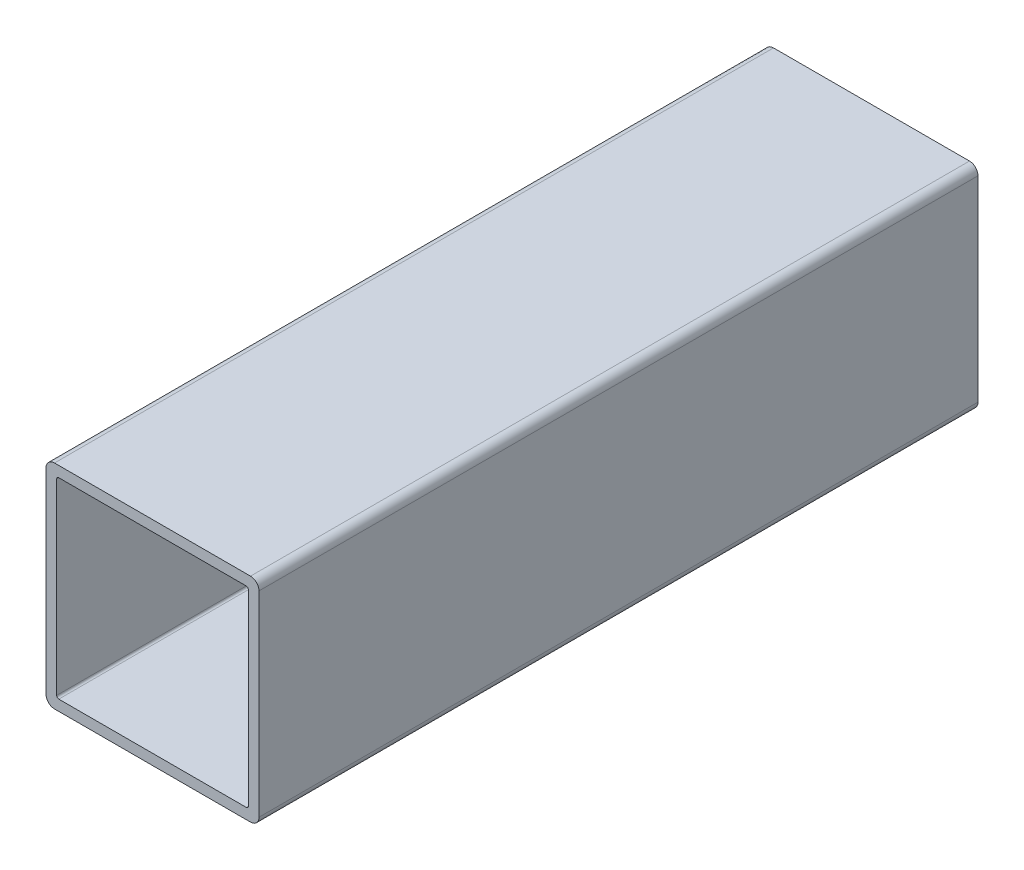
ISO-10303-21;
HEADER;
FILE_DESCRIPTION(('STEP AP214'),'2;1');
FILE_NAME('part.step','',(''),(''),'','','');
FILE_SCHEMA(('AUTOMOTIVE_DESIGN { 1 0 10303 214 1 1 1 1 }'));
ENDSEC;
DATA;
#1=APPLICATION_CONTEXT('core data for automotive mechanical design processes');
#2=APPLICATION_PROTOCOL_DEFINITION('international standard','automotive_design',2000,#1);
#3=PRODUCT_CONTEXT('',#1,'mechanical');
#4=PRODUCT('Part','Part','',(#3));
#5=PRODUCT_RELATED_PRODUCT_CATEGORY('part','',(#4));
#6=PRODUCT_DEFINITION_FORMATION('','',#4);
#7=PRODUCT_DEFINITION_CONTEXT('part definition',#1,'design');
#8=PRODUCT_DEFINITION('design','',#6,#7);
#9=PRODUCT_DEFINITION_SHAPE('','',#8);
#10=(LENGTH_UNIT() NAMED_UNIT(*) SI_UNIT(.MILLI.,.METRE.));
#11=(NAMED_UNIT(*) PLANE_ANGLE_UNIT() SI_UNIT($,.RADIAN.));
#12=(NAMED_UNIT(*) SI_UNIT($,.STERADIAN.) SOLID_ANGLE_UNIT());
#13=UNCERTAINTY_MEASURE_WITH_UNIT(LENGTH_MEASURE(1.E-05),#10,'distance_accuracy_value','');
#14=(GEOMETRIC_REPRESENTATION_CONTEXT(3) GLOBAL_UNCERTAINTY_ASSIGNED_CONTEXT((#13)) GLOBAL_UNIT_ASSIGNED_CONTEXT((#10,
#11,#12)) REPRESENTATION_CONTEXT('',''));
#15=CARTESIAN_POINT('',(0.,0.,0.));
#16=DIRECTION('',(0.,0.,1.));
#17=DIRECTION('',(1.,0.,0.));
#18=AXIS2_PLACEMENT_3D('',#15,#16,#17);
#19=CARTESIAN_POINT('',(358.3,0.,-825.));
#20=DIRECTION('',(0.,0.,1.));
#21=DIRECTION('',(1.,0.,0.));
#22=AXIS2_PLACEMENT_3D('',#19,#20,#21);
#23=PLANE('',#22);
#24=DIRECTION('',(0.,1.,0.));
#25=VECTOR('',#24,1.);
#26=CARTESIAN_POINT('',(-363.3,-4.45076074760841E-13,-825.));
#27=LINE('',#26,#25);
#28=CARTESIAN_POINT('',(-363.3,5.99999999999999,-825.));
#29=VERTEX_POINT('',#28);
#30=CARTESIAN_POINT('',(-363.3,94.,-825.));
#31=VERTEX_POINT('',#30);
#32=EDGE_CURVE('E232',#29,#31,#27,.T.);
#33=ORIENTED_EDGE('',*,*,#32,.T.);
#34=CARTESIAN_POINT('',(-364.3,94.,-825.));
#35=DIRECTION('',(0.,0.,1.));
#36=DIRECTION('',(1.,0.,0.));
#37=AXIS2_PLACEMENT_3D('',#34,#35,#36);
#38=CIRCLE('',#37,1.);
#39=CARTESIAN_POINT('',(-364.3,95.,-825.));
#40=VERTEX_POINT('',#39);
#41=EDGE_CURVE('E12',#31,#40,#38,.T.);
#42=ORIENTED_EDGE('',*,*,#41,.T.);
#43=DIRECTION('',(-1.,0.,0.));
#44=VECTOR('',#43,1.);
#45=CARTESIAN_POINT('',(358.3,94.9999999999999,-825.));
#46=LINE('',#45,#44);
#47=CARTESIAN_POINT('',(-452.3,95.,-825.));
#48=VERTEX_POINT('',#47);
#49=EDGE_CURVE('E229',#40,#48,#46,.T.);
#50=ORIENTED_EDGE('',*,*,#49,.T.);
#51=CARTESIAN_POINT('',(-452.3,94.,-825.));
#52=DIRECTION('',(0.,0.,1.));
#53=DIRECTION('',(1.,0.,0.));
#54=AXIS2_PLACEMENT_3D('',#51,#52,#53);
#55=CIRCLE('',#54,1.);
#56=CARTESIAN_POINT('',(-453.3,94.,-825.));
#57=VERTEX_POINT('',#56);
#58=EDGE_CURVE('E211',#48,#57,#55,.T.);
#59=ORIENTED_EDGE('',*,*,#58,.T.);
#60=DIRECTION('',(0.,-1.,0.));
#61=VECTOR('',#60,1.);
#62=CARTESIAN_POINT('',(-453.3,0.,-825.));
#63=LINE('',#62,#61);
#64=CARTESIAN_POINT('',(-453.3,5.99999999999999,-825.));
#65=VERTEX_POINT('',#64);
#66=EDGE_CURVE('E231',#57,#65,#63,.T.);
#67=ORIENTED_EDGE('',*,*,#66,.T.);
#68=CARTESIAN_POINT('',(-452.3,5.99999999999999,-825.));
#69=DIRECTION('',(0.,0.,1.));
#70=DIRECTION('',(1.,0.,0.));
#71=AXIS2_PLACEMENT_3D('',#68,#69,#70);
#72=CIRCLE('',#71,1.);
#73=CARTESIAN_POINT('',(-452.3,4.99999999999999,-825.));
#74=VERTEX_POINT('',#73);
#75=EDGE_CURVE('E207',#65,#74,#72,.T.);
#76=ORIENTED_EDGE('',*,*,#75,.T.);
#77=DIRECTION('',(1.,0.,0.));
#78=VECTOR('',#77,1.);
#79=CARTESIAN_POINT('',(358.3,4.99999999999999,-825.));
#80=LINE('',#79,#78);
#81=CARTESIAN_POINT('',(-364.3,4.99999999999999,-825.));
#82=VERTEX_POINT('',#81);
#83=EDGE_CURVE('E236',#74,#82,#80,.T.);
#84=ORIENTED_EDGE('',*,*,#83,.T.);
#85=CARTESIAN_POINT('',(-364.3,5.99999999999999,-825.));
#86=DIRECTION('',(0.,0.,1.));
#87=DIRECTION('',(1.,0.,0.));
#88=AXIS2_PLACEMENT_3D('',#85,#86,#87);
#89=CIRCLE('',#88,1.);
#90=EDGE_CURVE('E203',#82,#29,#89,.T.);
#91=ORIENTED_EDGE('',*,*,#90,.T.);
#92=EDGE_LOOP('',(#33,#42,#50,#59,#67,#76,#84,#91));
#93=FACE_BOUND('',#92,.T.);
#94=DIRECTION('',(-1.,0.,0.));
#95=VECTOR('',#94,1.);
#96=CARTESIAN_POINT('',(0.,0.,-825.));
#97=LINE('',#96,#95);
#98=CARTESIAN_POINT('',(-362.3,0.,-825.));
#99=VERTEX_POINT('',#98);
#100=CARTESIAN_POINT('',(-454.3,0.,-825.));
#101=VERTEX_POINT('',#100);
#102=EDGE_CURVE('E136',#99,#101,#97,.T.);
#103=ORIENTED_EDGE('',*,*,#102,.T.);
#104=CARTESIAN_POINT('',(-454.3,4.,-825.));
#105=DIRECTION('',(0.,0.,1.));
#106=DIRECTION('',(1.,0.,0.));
#107=AXIS2_PLACEMENT_3D('',#104,#105,#106);
#108=CIRCLE('',#107,4.);
#109=CARTESIAN_POINT('',(-458.3,4.,-825.));
#110=VERTEX_POINT('',#109);
#111=EDGE_CURVE('E142',#101,#110,#108,.F.);
#112=ORIENTED_EDGE('',*,*,#111,.T.);
#113=DIRECTION('',(0.,1.,0.));
#114=VECTOR('',#113,1.);
#115=CARTESIAN_POINT('',(-458.3,100.,-825.));
#116=LINE('',#115,#114);
#117=CARTESIAN_POINT('',(-458.3,96.,-825.));
#118=VERTEX_POINT('',#117);
#119=EDGE_CURVE('E243',#118,#110,#116,.F.);
#120=ORIENTED_EDGE('',*,*,#119,.F.);
#121=CARTESIAN_POINT('',(-454.3,96.,-825.));
#122=DIRECTION('',(0.,0.,1.));
#123=DIRECTION('',(1.,0.,0.));
#124=AXIS2_PLACEMENT_3D('',#121,#122,#123);
#125=CIRCLE('',#124,4.);
#126=CARTESIAN_POINT('',(-454.3,100.,-825.));
#127=VERTEX_POINT('',#126);
#128=EDGE_CURVE('E161',#118,#127,#125,.F.);
#129=ORIENTED_EDGE('',*,*,#128,.T.);
#130=DIRECTION('',(1.,0.,0.));
#131=VECTOR('',#130,1.);
#132=CARTESIAN_POINT('',(358.3,100.,-825.));
#133=LINE('',#132,#131);
#134=CARTESIAN_POINT('',(-362.3,100.,-825.));
#135=VERTEX_POINT('',#134);
#136=EDGE_CURVE('E267',#127,#135,#133,.T.);
#137=ORIENTED_EDGE('',*,*,#136,.T.);
#138=CARTESIAN_POINT('',(-362.3,96.,-825.));
#139=DIRECTION('',(0.,0.,1.));
#140=DIRECTION('',(1.,0.,0.));
#141=AXIS2_PLACEMENT_3D('',#138,#139,#140);
#142=CIRCLE('',#141,4.);
#143=CARTESIAN_POINT('',(-358.3,96.,-825.));
#144=VERTEX_POINT('',#143);
#145=EDGE_CURVE('E143',#135,#144,#142,.F.);
#146=ORIENTED_EDGE('',*,*,#145,.T.);
#147=DIRECTION('',(0.,1.,0.));
#148=VECTOR('',#147,1.);
#149=CARTESIAN_POINT('',(-358.3,100.,-825.));
#150=LINE('',#149,#148);
#151=CARTESIAN_POINT('',(-358.3,4.,-825.));
#152=VERTEX_POINT('',#151);
#153=EDGE_CURVE('E138',#144,#152,#150,.F.);
#154=ORIENTED_EDGE('',*,*,#153,.T.);
#155=CARTESIAN_POINT('',(-362.3,4.,-825.));
#156=DIRECTION('',(0.,0.,1.));
#157=DIRECTION('',(1.,0.,0.));
#158=AXIS2_PLACEMENT_3D('',#155,#156,#157);
#159=CIRCLE('',#158,4.);
#160=EDGE_CURVE('E133',#152,#99,#159,.F.);
#161=ORIENTED_EDGE('',*,*,#160,.T.);
#162=EDGE_LOOP('',(#103,#112,#120,#129,#137,#146,#154,#161));
#163=FACE_BOUND('',#162,.T.);
#164=ADVANCED_FACE('F19',(#93,#163),#23,.F.);
#165=CARTESIAN_POINT('',(-358.3,0.,-487.5));
#166=DIRECTION('',(0.,0.,-1.));
#167=DIRECTION('',(-1.,0.,0.));
#168=AXIS2_PLACEMENT_3D('',#165,#166,#167);
#169=PLANE('',#168);
#170=DIRECTION('',(0.,-1.,0.));
#171=VECTOR('',#170,1.);
#172=CARTESIAN_POINT('',(-363.3,0.,-487.5));
#173=LINE('',#172,#171);
#174=CARTESIAN_POINT('',(-363.3,94.,-487.5));
#175=VERTEX_POINT('',#174);
#176=CARTESIAN_POINT('',(-363.3,6.,-487.5));
#177=VERTEX_POINT('',#176);
#178=EDGE_CURVE('E218',#175,#177,#173,.T.);
#179=ORIENTED_EDGE('',*,*,#178,.T.);
#180=CARTESIAN_POINT('',(-364.3,6.,-487.5));
#181=DIRECTION('',(0.,0.,-1.));
#182=DIRECTION('',(-1.,0.,0.));
#183=AXIS2_PLACEMENT_3D('',#180,#181,#182);
#184=CIRCLE('',#183,1.);
#185=CARTESIAN_POINT('',(-364.3,5.,-487.5));
#186=VERTEX_POINT('',#185);
#187=EDGE_CURVE('E201',#177,#186,#184,.T.);
#188=ORIENTED_EDGE('',*,*,#187,.T.);
#189=DIRECTION('',(-1.,0.,0.));
#190=VECTOR('',#189,1.);
#191=CARTESIAN_POINT('',(-358.3,5.,-487.5));
#192=LINE('',#191,#190);
#193=CARTESIAN_POINT('',(-452.3,5.,-487.5));
#194=VERTEX_POINT('',#193);
#195=EDGE_CURVE('E226',#186,#194,#192,.T.);
#196=ORIENTED_EDGE('',*,*,#195,.T.);
#197=CARTESIAN_POINT('',(-452.3,6.,-487.5));
#198=DIRECTION('',(0.,0.,-1.));
#199=DIRECTION('',(-1.,0.,0.));
#200=AXIS2_PLACEMENT_3D('',#197,#198,#199);
#201=CIRCLE('',#200,1.);
#202=CARTESIAN_POINT('',(-453.3,6.,-487.5));
#203=VERTEX_POINT('',#202);
#204=EDGE_CURVE('E205',#194,#203,#201,.T.);
#205=ORIENTED_EDGE('',*,*,#204,.T.);
#206=DIRECTION('',(0.,1.,0.));
#207=VECTOR('',#206,1.);
#208=CARTESIAN_POINT('',(-453.3,0.,-487.5));
#209=LINE('',#208,#207);
#210=CARTESIAN_POINT('',(-453.3,94.,-487.5));
#211=VERTEX_POINT('',#210);
#212=EDGE_CURVE('E159',#203,#211,#209,.T.);
#213=ORIENTED_EDGE('',*,*,#212,.T.);
#214=CARTESIAN_POINT('',(-452.3,94.,-487.5));
#215=DIRECTION('',(0.,0.,-1.));
#216=DIRECTION('',(-1.,0.,0.));
#217=AXIS2_PLACEMENT_3D('',#214,#215,#216);
#218=CIRCLE('',#217,1.);
#219=CARTESIAN_POINT('',(-452.3,95.,-487.5));
#220=VERTEX_POINT('',#219);
#221=EDGE_CURVE('E209',#211,#220,#218,.T.);
#222=ORIENTED_EDGE('',*,*,#221,.T.);
#223=DIRECTION('',(1.,0.,0.));
#224=VECTOR('',#223,1.);
#225=CARTESIAN_POINT('',(-358.3,95.,-487.5));
#226=LINE('',#225,#224);
#227=CARTESIAN_POINT('',(-364.3,95.,-487.5));
#228=VERTEX_POINT('',#227);
#229=EDGE_CURVE('E164',#220,#228,#226,.T.);
#230=ORIENTED_EDGE('',*,*,#229,.T.);
#231=CARTESIAN_POINT('',(-364.3,94.,-487.5));
#232=DIRECTION('',(0.,0.,-1.));
#233=DIRECTION('',(-1.,0.,0.));
#234=AXIS2_PLACEMENT_3D('',#231,#232,#233);
#235=CIRCLE('',#234,1.);
#236=EDGE_CURVE('E27',#228,#175,#235,.T.);
#237=ORIENTED_EDGE('',*,*,#236,.T.);
#238=EDGE_LOOP('',(#179,#188,#196,#205,#213,#222,#230,#237));
#239=FACE_BOUND('',#238,.T.);
#240=DIRECTION('',(0.,1.,0.));
#241=VECTOR('',#240,1.);
#242=CARTESIAN_POINT('',(-458.3,100.,-487.5));
#243=LINE('',#242,#241);
#244=CARTESIAN_POINT('',(-458.3,4.,-487.5));
#245=VERTEX_POINT('',#244);
#246=CARTESIAN_POINT('',(-458.3,96.,-487.5));
#247=VERTEX_POINT('',#246);
#248=EDGE_CURVE('E245',#245,#247,#243,.T.);
#249=ORIENTED_EDGE('',*,*,#248,.F.);
#250=CARTESIAN_POINT('',(-454.3,4.,-487.5));
#251=DIRECTION('',(0.,0.,-1.));
#252=DIRECTION('',(-1.,0.,0.));
#253=AXIS2_PLACEMENT_3D('',#250,#251,#252);
#254=CIRCLE('',#253,4.);
#255=CARTESIAN_POINT('',(-454.3,0.,-487.5));
#256=VERTEX_POINT('',#255);
#257=EDGE_CURVE('E295',#245,#256,#254,.F.);
#258=ORIENTED_EDGE('',*,*,#257,.T.);
#259=DIRECTION('',(1.,0.,0.));
#260=VECTOR('',#259,1.);
#261=CARTESIAN_POINT('',(0.,0.,-487.5));
#262=LINE('',#261,#260);
#263=CARTESIAN_POINT('',(-362.3,0.,-487.5));
#264=VERTEX_POINT('',#263);
#265=EDGE_CURVE('E155',#256,#264,#262,.T.);
#266=ORIENTED_EDGE('',*,*,#265,.T.);
#267=CARTESIAN_POINT('',(-362.3,4.,-487.5));
#268=DIRECTION('',(0.,0.,-1.));
#269=DIRECTION('',(-1.,0.,0.));
#270=AXIS2_PLACEMENT_3D('',#267,#268,#269);
#271=CIRCLE('',#270,4.);
#272=CARTESIAN_POINT('',(-358.3,4.,-487.5));
#273=VERTEX_POINT('',#272);
#274=EDGE_CURVE('E158',#264,#273,#271,.F.);
#275=ORIENTED_EDGE('',*,*,#274,.T.);
#276=DIRECTION('',(0.,1.,0.));
#277=VECTOR('',#276,1.);
#278=CARTESIAN_POINT('',(-358.3,100.,-487.5));
#279=LINE('',#278,#277);
#280=CARTESIAN_POINT('',(-358.3,96.,-487.5));
#281=VERTEX_POINT('',#280);
#282=EDGE_CURVE('E242',#273,#281,#279,.T.);
#283=ORIENTED_EDGE('',*,*,#282,.T.);
#284=CARTESIAN_POINT('',(-362.3,96.,-487.5));
#285=DIRECTION('',(0.,0.,-1.));
#286=DIRECTION('',(-1.,0.,0.));
#287=AXIS2_PLACEMENT_3D('',#284,#285,#286);
#288=CIRCLE('',#287,4.);
#289=CARTESIAN_POINT('',(-362.3,100.,-487.5));
#290=VERTEX_POINT('',#289);
#291=EDGE_CURVE('E285',#281,#290,#288,.F.);
#292=ORIENTED_EDGE('',*,*,#291,.T.);
#293=DIRECTION('',(-1.,0.,0.));
#294=VECTOR('',#293,1.);
#295=CARTESIAN_POINT('',(358.3,100.,-487.5));
#296=LINE('',#295,#294);
#297=CARTESIAN_POINT('',(-454.3,100.,-487.5));
#298=VERTEX_POINT('',#297);
#299=EDGE_CURVE('E154',#290,#298,#296,.T.);
#300=ORIENTED_EDGE('',*,*,#299,.T.);
#301=CARTESIAN_POINT('',(-454.3,96.,-487.5));
#302=DIRECTION('',(0.,0.,-1.));
#303=DIRECTION('',(-1.,0.,0.));
#304=AXIS2_PLACEMENT_3D('',#301,#302,#303);
#305=CIRCLE('',#304,4.);
#306=EDGE_CURVE('E280',#298,#247,#305,.F.);
#307=ORIENTED_EDGE('',*,*,#306,.T.);
#308=EDGE_LOOP('',(#249,#258,#266,#275,#283,#292,#300,#307));
#309=FACE_BOUND('',#308,.T.);
#310=ADVANCED_FACE('F216',(#239,#309),#169,.F.);
#311=CARTESIAN_POINT('',(0.,0.,0.));
#312=DIRECTION('',(0.,-1.,0.));
#313=DIRECTION('',(0.,0.,-1.));
#314=AXIS2_PLACEMENT_3D('',#311,#312,#313);
#315=PLANE('',#314);
#316=ORIENTED_EDGE('',*,*,#265,.F.);
#317=DIRECTION('',(0.,0.,-1.));
#318=VECTOR('',#317,1.);
#319=CARTESIAN_POINT('',(-454.3,0.,-825.));
#320=LINE('',#319,#318);
#321=EDGE_CURVE('E153',#256,#101,#320,.T.);
#322=ORIENTED_EDGE('',*,*,#321,.T.);
#323=ORIENTED_EDGE('',*,*,#102,.F.);
#324=DIRECTION('',(0.,0.,1.));
#325=VECTOR('',#324,1.);
#326=CARTESIAN_POINT('',(-362.3,0.,-487.5));
#327=LINE('',#326,#325);
#328=EDGE_CURVE('E150',#99,#264,#327,.T.);
#329=ORIENTED_EDGE('',*,*,#328,.T.);
#330=EDGE_LOOP('',(#316,#322,#323,#329));
#331=FACE_BOUND('',#330,.T.);
#332=ADVANCED_FACE('F149',(#331),#315,.T.);
#333=CARTESIAN_POINT('',(358.3,100.,925.));
#334=DIRECTION('',(0.,1.,0.));
#335=DIRECTION('',(0.,0.,1.));
#336=AXIS2_PLACEMENT_3D('',#333,#334,#335);
#337=PLANE('',#336);
#338=ORIENTED_EDGE('',*,*,#299,.F.);
#339=DIRECTION('',(0.,0.,-1.));
#340=VECTOR('',#339,1.);
#341=CARTESIAN_POINT('',(-362.3,100.,-825.));
#342=LINE('',#341,#340);
#343=EDGE_CURVE('E175',#290,#135,#342,.T.);
#344=ORIENTED_EDGE('',*,*,#343,.T.);
#345=ORIENTED_EDGE('',*,*,#136,.F.);
#346=DIRECTION('',(0.,0.,1.));
#347=VECTOR('',#346,1.);
#348=CARTESIAN_POINT('',(-454.3,100.,-487.5));
#349=LINE('',#348,#347);
#350=EDGE_CURVE('E180',#127,#298,#349,.T.);
#351=ORIENTED_EDGE('',*,*,#350,.T.);
#352=EDGE_LOOP('',(#338,#344,#345,#351));
#353=FACE_BOUND('',#352,.T.);
#354=ADVANCED_FACE('F302',(#353),#337,.T.);
#355=CARTESIAN_POINT('',(-358.3,100.,0.));
#356=DIRECTION('',(-1.,0.,0.));
#357=DIRECTION('',(0.,0.,1.));
#358=AXIS2_PLACEMENT_3D('',#355,#356,#357);
#359=PLANE('',#358);
#360=ORIENTED_EDGE('',*,*,#282,.F.);
#361=DIRECTION('',(0.,0.,1.));
#362=VECTOR('',#361,1.);
#363=CARTESIAN_POINT('',(-358.3,4.,-825.));
#364=LINE('',#363,#362);
#365=EDGE_CURVE('E298',#273,#152,#364,.F.);
#366=ORIENTED_EDGE('',*,*,#365,.T.);
#367=ORIENTED_EDGE('',*,*,#153,.F.);
#368=DIRECTION('',(0.,0.,-1.));
#369=VECTOR('',#368,1.);
#370=CARTESIAN_POINT('',(-358.3,96.,-487.5));
#371=LINE('',#370,#369);
#372=EDGE_CURVE('E297',#144,#281,#371,.F.);
#373=ORIENTED_EDGE('',*,*,#372,.T.);
#374=EDGE_LOOP('',(#360,#366,#367,#373));
#375=FACE_BOUND('',#374,.T.);
#376=ADVANCED_FACE('F311',(#375),#359,.F.);
#377=CARTESIAN_POINT('',(-458.3,100.,-387.5));
#378=DIRECTION('',(1.,0.,0.));
#379=DIRECTION('',(0.,0.,-1.));
#380=AXIS2_PLACEMENT_3D('',#377,#378,#379);
#381=PLANE('',#380);
#382=ORIENTED_EDGE('',*,*,#119,.T.);
#383=DIRECTION('',(0.,0.,-1.));
#384=VECTOR('',#383,1.);
#385=CARTESIAN_POINT('',(-458.3,4.,-487.5));
#386=LINE('',#385,#384);
#387=EDGE_CURVE('E278',#110,#245,#386,.F.);
#388=ORIENTED_EDGE('',*,*,#387,.T.);
#389=ORIENTED_EDGE('',*,*,#248,.T.);
#390=DIRECTION('',(0.,0.,1.));
#391=VECTOR('',#390,1.);
#392=CARTESIAN_POINT('',(-458.3,96.,-825.));
#393=LINE('',#392,#391);
#394=EDGE_CURVE('E275',#247,#118,#393,.F.);
#395=ORIENTED_EDGE('',*,*,#394,.T.);
#396=EDGE_LOOP('',(#382,#388,#389,#395));
#397=FACE_BOUND('',#396,.T.);
#398=ADVANCED_FACE('F273',(#397),#381,.F.);
#399=CARTESIAN_POINT('',(-453.3,95.,-925.));
#400=DIRECTION('',(-1.,0.,0.));
#401=DIRECTION('',(0.,0.,1.));
#402=AXIS2_PLACEMENT_3D('',#399,#400,#401);
#403=PLANE('',#402);
#404=ORIENTED_EDGE('',*,*,#212,.F.);
#405=DIRECTION('',(0.,0.,1.));
#406=VECTOR('',#405,1.);
#407=CARTESIAN_POINT('',(-453.3,5.99999999999999,-825.));
#408=LINE('',#407,#406);
#409=EDGE_CURVE('E195',#203,#65,#408,.F.);
#410=ORIENTED_EDGE('',*,*,#409,.T.);
#411=ORIENTED_EDGE('',*,*,#66,.F.);
#412=DIRECTION('',(0.,0.,1.));
#413=VECTOR('',#412,1.);
#414=CARTESIAN_POINT('',(-453.3,94.,-487.5));
#415=LINE('',#414,#413);
#416=EDGE_CURVE('E192',#57,#211,#415,.T.);
#417=ORIENTED_EDGE('',*,*,#416,.T.);
#418=EDGE_LOOP('',(#404,#410,#411,#417));
#419=FACE_BOUND('',#418,.T.);
#420=ADVANCED_FACE('F319',(#419),#403,.F.);
#421=CARTESIAN_POINT('',(-363.3,95.,-925.));
#422=DIRECTION('',(0.,1.,0.));
#423=DIRECTION('',(-1.,0.,0.));
#424=AXIS2_PLACEMENT_3D('',#421,#422,#423);
#425=PLANE('',#424);
#426=ORIENTED_EDGE('',*,*,#229,.F.);
#427=DIRECTION('',(0.,0.,1.));
#428=VECTOR('',#427,1.);
#429=CARTESIAN_POINT('',(-452.3,95.,-825.));
#430=LINE('',#429,#428);
#431=EDGE_CURVE('E34',#220,#48,#430,.F.);
#432=ORIENTED_EDGE('',*,*,#431,.T.);
#433=ORIENTED_EDGE('',*,*,#49,.F.);
#434=DIRECTION('',(0.,0.,1.));
#435=VECTOR('',#434,1.);
#436=CARTESIAN_POINT('',(-364.3,95.,-487.5));
#437=LINE('',#436,#435);
#438=EDGE_CURVE('E197',#40,#228,#437,.T.);
#439=ORIENTED_EDGE('',*,*,#438,.T.);
#440=EDGE_LOOP('',(#426,#432,#433,#439));
#441=FACE_BOUND('',#440,.T.);
#442=ADVANCED_FACE('F228',(#441),#425,.F.);
#443=CARTESIAN_POINT('',(-363.3,4.99999999999998,-925.));
#444=DIRECTION('',(1.,0.,0.));
#445=DIRECTION('',(0.,1.,0.));
#446=AXIS2_PLACEMENT_3D('',#443,#444,#445);
#447=PLANE('',#446);
#448=ORIENTED_EDGE('',*,*,#32,.F.);
#449=DIRECTION('',(0.,0.,1.));
#450=VECTOR('',#449,1.);
#451=CARTESIAN_POINT('',(-363.3,6.,-487.5));
#452=LINE('',#451,#450);
#453=EDGE_CURVE('E184',#29,#177,#452,.T.);
#454=ORIENTED_EDGE('',*,*,#453,.T.);
#455=ORIENTED_EDGE('',*,*,#178,.F.);
#456=DIRECTION('',(0.,0.,1.));
#457=VECTOR('',#456,1.);
#458=CARTESIAN_POINT('',(-363.3,94.,-825.));
#459=LINE('',#458,#457);
#460=EDGE_CURVE('E179',#175,#31,#459,.F.);
#461=ORIENTED_EDGE('',*,*,#460,.T.);
#462=EDGE_LOOP('',(#448,#454,#455,#461));
#463=FACE_BOUND('',#462,.T.);
#464=ADVANCED_FACE('F224',(#463),#447,.F.);
#465=CARTESIAN_POINT('',(-453.3,4.99999999999998,-925.));
#466=DIRECTION('',(0.,-1.,0.));
#467=DIRECTION('',(0.,0.,-1.));
#468=AXIS2_PLACEMENT_3D('',#465,#466,#467);
#469=PLANE('',#468);
#470=ORIENTED_EDGE('',*,*,#195,.F.);
#471=DIRECTION('',(0.,0.,1.));
#472=VECTOR('',#471,1.);
#473=CARTESIAN_POINT('',(-364.3,4.99999999999999,-825.));
#474=LINE('',#473,#472);
#475=EDGE_CURVE('E190',#186,#82,#474,.F.);
#476=ORIENTED_EDGE('',*,*,#475,.T.);
#477=ORIENTED_EDGE('',*,*,#83,.F.);
#478=DIRECTION('',(0.,0.,1.));
#479=VECTOR('',#478,1.);
#480=CARTESIAN_POINT('',(-452.3,5.,-487.5));
#481=LINE('',#480,#479);
#482=EDGE_CURVE('E187',#74,#194,#481,.T.);
#483=ORIENTED_EDGE('',*,*,#482,.T.);
#484=EDGE_LOOP('',(#470,#476,#477,#483));
#485=FACE_BOUND('',#484,.T.);
#486=ADVANCED_FACE('F334',(#485),#469,.F.);
#487=CARTESIAN_POINT('',(-454.3,4.,0.));
#488=DIRECTION('',(0.,0.,1.));
#489=DIRECTION('',(1.,0.,0.));
#490=AXIS2_PLACEMENT_3D('',#487,#488,#489);
#491=CYLINDRICAL_SURFACE('',#490,4.);
#492=ORIENTED_EDGE('',*,*,#257,.F.);
#493=ORIENTED_EDGE('',*,*,#387,.F.);
#494=ORIENTED_EDGE('',*,*,#111,.F.);
#495=ORIENTED_EDGE('',*,*,#321,.F.);
#496=EDGE_LOOP('',(#492,#493,#494,#495));
#497=FACE_BOUND('',#496,.T.);
#498=ADVANCED_FACE('F310',(#497),#491,.T.);
#499=CARTESIAN_POINT('',(-362.3,4.,0.));
#500=DIRECTION('',(0.,0.,-1.));
#501=DIRECTION('',(-1.,0.,0.));
#502=AXIS2_PLACEMENT_3D('',#499,#500,#501);
#503=CYLINDRICAL_SURFACE('',#502,4.);
#504=ORIENTED_EDGE('',*,*,#160,.F.);
#505=ORIENTED_EDGE('',*,*,#365,.F.);
#506=ORIENTED_EDGE('',*,*,#274,.F.);
#507=ORIENTED_EDGE('',*,*,#328,.F.);
#508=EDGE_LOOP('',(#504,#505,#506,#507));
#509=FACE_BOUND('',#508,.T.);
#510=ADVANCED_FACE('F157',(#509),#503,.T.);
#511=CARTESIAN_POINT('',(-362.3,96.,925.));
#512=DIRECTION('',(0.,0.,1.));
#513=DIRECTION('',(1.,0.,0.));
#514=AXIS2_PLACEMENT_3D('',#511,#512,#513);
#515=CYLINDRICAL_SURFACE('',#514,4.);
#516=ORIENTED_EDGE('',*,*,#291,.F.);
#517=ORIENTED_EDGE('',*,*,#372,.F.);
#518=ORIENTED_EDGE('',*,*,#145,.F.);
#519=ORIENTED_EDGE('',*,*,#343,.F.);
#520=EDGE_LOOP('',(#516,#517,#518,#519));
#521=FACE_BOUND('',#520,.T.);
#522=ADVANCED_FACE('F306',(#521),#515,.T.);
#523=CARTESIAN_POINT('',(-454.3,96.,925.));
#524=DIRECTION('',(0.,0.,-1.));
#525=DIRECTION('',(-1.,0.,0.));
#526=AXIS2_PLACEMENT_3D('',#523,#524,#525);
#527=CYLINDRICAL_SURFACE('',#526,4.);
#528=ORIENTED_EDGE('',*,*,#128,.F.);
#529=ORIENTED_EDGE('',*,*,#394,.F.);
#530=ORIENTED_EDGE('',*,*,#306,.F.);
#531=ORIENTED_EDGE('',*,*,#350,.F.);
#532=EDGE_LOOP('',(#528,#529,#530,#531));
#533=FACE_BOUND('',#532,.T.);
#534=ADVANCED_FACE('F288',(#533),#527,.T.);
#535=CARTESIAN_POINT('',(-364.3,5.99999999999998,-925.));
#536=DIRECTION('',(0.,0.,-1.));
#537=DIRECTION('',(0.,1.,0.));
#538=AXIS2_PLACEMENT_3D('',#535,#536,#537);
#539=CYLINDRICAL_SURFACE('',#538,1.);
#540=ORIENTED_EDGE('',*,*,#90,.F.);
#541=ORIENTED_EDGE('',*,*,#475,.F.);
#542=ORIENTED_EDGE('',*,*,#187,.F.);
#543=ORIENTED_EDGE('',*,*,#453,.F.);
#544=EDGE_LOOP('',(#540,#541,#542,#543));
#545=FACE_BOUND('',#544,.T.);
#546=ADVANCED_FACE('F341',(#545),#539,.F.);
#547=CARTESIAN_POINT('',(-452.3,5.99999999999998,-925.));
#548=DIRECTION('',(0.,0.,-1.));
#549=DIRECTION('',(0.,1.,0.));
#550=AXIS2_PLACEMENT_3D('',#547,#548,#549);
#551=CYLINDRICAL_SURFACE('',#550,1.);
#552=ORIENTED_EDGE('',*,*,#75,.F.);
#553=ORIENTED_EDGE('',*,*,#409,.F.);
#554=ORIENTED_EDGE('',*,*,#204,.F.);
#555=ORIENTED_EDGE('',*,*,#482,.F.);
#556=EDGE_LOOP('',(#552,#553,#554,#555));
#557=FACE_BOUND('',#556,.T.);
#558=ADVANCED_FACE('F344',(#557),#551,.F.);
#559=CARTESIAN_POINT('',(-452.3,94.,-925.));
#560=DIRECTION('',(0.,0.,-1.));
#561=DIRECTION('',(0.,1.,0.));
#562=AXIS2_PLACEMENT_3D('',#559,#560,#561);
#563=CYLINDRICAL_SURFACE('',#562,1.);
#564=ORIENTED_EDGE('',*,*,#58,.F.);
#565=ORIENTED_EDGE('',*,*,#431,.F.);
#566=ORIENTED_EDGE('',*,*,#221,.F.);
#567=ORIENTED_EDGE('',*,*,#416,.F.);
#568=EDGE_LOOP('',(#564,#565,#566,#567));
#569=FACE_BOUND('',#568,.T.);
#570=ADVANCED_FACE('F347',(#569),#563,.F.);
#571=CARTESIAN_POINT('',(-364.3,94.,-925.));
#572=DIRECTION('',(0.,0.,-1.));
#573=DIRECTION('',(0.,1.,0.));
#574=AXIS2_PLACEMENT_3D('',#571,#572,#573);
#575=CYLINDRICAL_SURFACE('',#574,1.);
#576=ORIENTED_EDGE('',*,*,#41,.F.);
#577=ORIENTED_EDGE('',*,*,#460,.F.);
#578=ORIENTED_EDGE('',*,*,#236,.F.);
#579=ORIENTED_EDGE('',*,*,#438,.F.);
#580=EDGE_LOOP('',(#576,#577,#578,#579));
#581=FACE_BOUND('',#580,.T.);
#582=ADVANCED_FACE('F21',(#581),#575,.F.);
#583=CLOSED_SHELL('',(#164,#310,#332,#354,#376,#398,#420,#442,#464,#486,#498,#510,#522,#534,
#546,#558,#570,#582));
#584=MANIFOLD_SOLID_BREP('B1',#583);
#585=ADVANCED_BREP_SHAPE_REPRESENTATION('',(#18,#584),#14);
#586=SHAPE_DEFINITION_REPRESENTATION(#9,#585);
ENDSEC;
END-ISO-10303-21;
